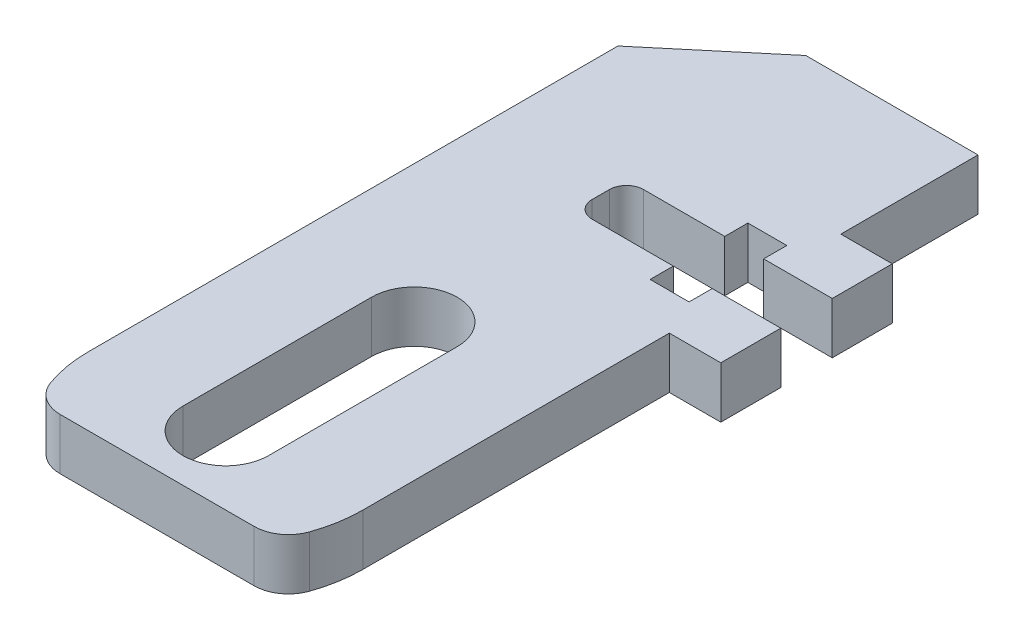
ISO-10303-21;
HEADER;
FILE_DESCRIPTION(('STEP AP214'),'2;1');
FILE_NAME('part.step','',(''),(''),'','','');
FILE_SCHEMA(('AUTOMOTIVE_DESIGN { 1 0 10303 214 1 1 1 1 }'));
ENDSEC;
DATA;
#1=APPLICATION_CONTEXT('core data for automotive mechanical design processes');
#2=APPLICATION_PROTOCOL_DEFINITION('international standard','automotive_design',2000,#1);
#3=PRODUCT_CONTEXT('',#1,'mechanical');
#4=PRODUCT('Part','Part','',(#3));
#5=PRODUCT_RELATED_PRODUCT_CATEGORY('part','',(#4));
#6=PRODUCT_DEFINITION_FORMATION('','',#4);
#7=PRODUCT_DEFINITION_CONTEXT('part definition',#1,'design');
#8=PRODUCT_DEFINITION('design','',#6,#7);
#9=PRODUCT_DEFINITION_SHAPE('','',#8);
#10=(LENGTH_UNIT() NAMED_UNIT(*) SI_UNIT(.MILLI.,.METRE.));
#11=(NAMED_UNIT(*) PLANE_ANGLE_UNIT() SI_UNIT($,.RADIAN.));
#12=(NAMED_UNIT(*) SI_UNIT($,.STERADIAN.) SOLID_ANGLE_UNIT());
#13=UNCERTAINTY_MEASURE_WITH_UNIT(LENGTH_MEASURE(1.E-05),#10,'distance_accuracy_value','');
#14=(GEOMETRIC_REPRESENTATION_CONTEXT(3) GLOBAL_UNCERTAINTY_ASSIGNED_CONTEXT((#13)) GLOBAL_UNIT_ASSIGNED_CONTEXT((#10,
#11,#12)) REPRESENTATION_CONTEXT('',''));
#15=CARTESIAN_POINT('',(0.,0.,0.));
#16=DIRECTION('',(0.,0.,1.));
#17=DIRECTION('',(1.,0.,0.));
#18=AXIS2_PLACEMENT_3D('',#15,#16,#17);
#19=CARTESIAN_POINT('',(11.,1.5,-27.870225));
#20=DIRECTION('',(-1.,0.,0.));
#21=DIRECTION('',(0.,0.,1.));
#22=AXIS2_PLACEMENT_3D('',#19,#20,#21);
#23=PLANE('',#22);
#24=DIRECTION('',(0.,0.,-1.));
#25=VECTOR('',#24,1.);
#26=CARTESIAN_POINT('',(11.,-1.5,-27.870225));
#27=LINE('',#26,#25);
#28=CARTESIAN_POINT('',(11.,-1.5,-17.870225));
#29=VERTEX_POINT('',#28);
#30=CARTESIAN_POINT('',(11.,-1.5,-21.370225));
#31=VERTEX_POINT('',#30);
#32=EDGE_CURVE('E300',#29,#31,#27,.T.);
#33=ORIENTED_EDGE('',*,*,#32,.T.);
#34=DIRECTION('',(0.,1.,0.));
#35=VECTOR('',#34,1.);
#36=CARTESIAN_POINT('',(11.,-1.5,-21.370225));
#37=LINE('',#36,#35);
#38=CARTESIAN_POINT('',(11.,1.5,-21.370225));
#39=VERTEX_POINT('',#38);
#40=EDGE_CURVE('E392',#31,#39,#37,.T.);
#41=ORIENTED_EDGE('',*,*,#40,.T.);
#42=DIRECTION('',(0.,0.,-1.));
#43=VECTOR('',#42,1.);
#44=CARTESIAN_POINT('',(11.,1.5,-27.870225));
#45=LINE('',#44,#43);
#46=CARTESIAN_POINT('',(11.,1.5,-17.870225));
#47=VERTEX_POINT('',#46);
#48=EDGE_CURVE('E265',#47,#39,#45,.T.);
#49=ORIENTED_EDGE('',*,*,#48,.F.);
#50=DIRECTION('',(0.,-1.,0.));
#51=VECTOR('',#50,1.);
#52=CARTESIAN_POINT('',(11.,1.5,-17.870225));
#53=LINE('',#52,#51);
#54=EDGE_CURVE('E327',#47,#29,#53,.T.);
#55=ORIENTED_EDGE('',*,*,#54,.T.);
#56=EDGE_LOOP('',(#33,#41,#49,#55));
#57=FACE_BOUND('',#56,.T.);
#58=ADVANCED_FACE('F39',(#57),#23,.F.);
#59=CARTESIAN_POINT('',(0.,1.5,0.));
#60=DIRECTION('',(0.,1.,0.));
#61=DIRECTION('',(0.,0.,1.));
#62=AXIS2_PLACEMENT_3D('',#59,#60,#61);
#63=PLANE('',#62);
#64=DIRECTION('',(1.,0.,0.));
#65=VECTOR('',#64,1.);
#66=CARTESIAN_POINT('',(11.,1.5,-21.370225));
#67=LINE('',#66,#65);
#68=CARTESIAN_POINT('',(6.99999999999999,1.5,-21.370225));
#69=VERTEX_POINT('',#68);
#70=EDGE_CURVE('E394',#69,#39,#67,.T.);
#71=ORIENTED_EDGE('',*,*,#70,.F.);
#72=DIRECTION('',(0.,0.,-1.));
#73=VECTOR('',#72,1.);
#74=CARTESIAN_POINT('',(6.99999999999999,1.5,-21.370225));
#75=LINE('',#74,#73);
#76=CARTESIAN_POINT('',(6.99999999999999,1.5,-20.020225));
#77=VERTEX_POINT('',#76);
#78=EDGE_CURVE('E397',#77,#69,#75,.T.);
#79=ORIENTED_EDGE('',*,*,#78,.F.);
#80=DIRECTION('',(1.,0.,0.));
#81=VECTOR('',#80,1.);
#82=CARTESIAN_POINT('',(4.72999999999999,1.5,-20.020225));
#83=LINE('',#82,#81);
#84=CARTESIAN_POINT('',(4.72999999999999,1.5,-20.020225));
#85=VERTEX_POINT('',#84);
#86=EDGE_CURVE('E402',#85,#77,#83,.T.);
#87=ORIENTED_EDGE('',*,*,#86,.F.);
#88=DIRECTION('',(0.,0.,1.));
#89=VECTOR('',#88,1.);
#90=CARTESIAN_POINT('',(4.72999999999999,1.5,-21.370225));
#91=LINE('',#90,#89);
#92=CARTESIAN_POINT('',(4.72999999999999,1.5,-21.370225));
#93=VERTEX_POINT('',#92);
#94=EDGE_CURVE('E849',#93,#85,#91,.T.);
#95=ORIENTED_EDGE('',*,*,#94,.F.);
#96=DIRECTION('',(1.,0.,0.));
#97=VECTOR('',#96,1.);
#98=CARTESIAN_POINT('',(4.72999999999999,1.5,-21.370225));
#99=LINE('',#98,#97);
#100=CARTESIAN_POINT('',(0.,1.5,-21.370225));
#101=VERTEX_POINT('',#100);
#102=EDGE_CURVE('E853',#101,#93,#99,.T.);
#103=ORIENTED_EDGE('',*,*,#102,.F.);
#104=CARTESIAN_POINT('',(0.,1.5,-22.370225));
#105=DIRECTION('',(0.,1.,0.));
#106=DIRECTION('',(0.,0.,-1.));
#107=AXIS2_PLACEMENT_3D('',#104,#105,#106);
#108=CIRCLE('',#107,0.999999999999999);
#109=CARTESIAN_POINT('',(-1.00000000000001,1.5,-22.370225));
#110=VERTEX_POINT('',#109);
#111=EDGE_CURVE('E842',#110,#101,#108,.T.);
#112=ORIENTED_EDGE('',*,*,#111,.F.);
#113=DIRECTION('',(0.,0.,1.));
#114=VECTOR('',#113,1.);
#115=CARTESIAN_POINT('',(-1.00000000000001,1.5,-23.370225));
#116=LINE('',#115,#114);
#117=CARTESIAN_POINT('',(-1.00000000000001,1.5,-23.370225));
#118=VERTEX_POINT('',#117);
#119=EDGE_CURVE('E838',#118,#110,#116,.T.);
#120=ORIENTED_EDGE('',*,*,#119,.F.);
#121=CARTESIAN_POINT('',(0.,1.5,-23.370225));
#122=DIRECTION('',(0.,1.,0.));
#123=DIRECTION('',(0.,0.,1.));
#124=AXIS2_PLACEMENT_3D('',#121,#122,#123);
#125=CIRCLE('',#124,0.999999999999999);
#126=CARTESIAN_POINT('',(0.,1.5,-24.370225));
#127=VERTEX_POINT('',#126);
#128=EDGE_CURVE('E859',#127,#118,#125,.T.);
#129=ORIENTED_EDGE('',*,*,#128,.F.);
#130=DIRECTION('',(-1.,0.,0.));
#131=VECTOR('',#130,1.);
#132=CARTESIAN_POINT('',(4.72999999999999,1.5,-24.370225));
#133=LINE('',#132,#131);
#134=CARTESIAN_POINT('',(4.72999999999999,1.5,-24.370225));
#135=VERTEX_POINT('',#134);
#136=EDGE_CURVE('E831',#135,#127,#133,.T.);
#137=ORIENTED_EDGE('',*,*,#136,.F.);
#138=DIRECTION('',(0.,0.,1.));
#139=VECTOR('',#138,1.);
#140=CARTESIAN_POINT('',(4.72999999999999,1.5,-25.720225));
#141=LINE('',#140,#139);
#142=CARTESIAN_POINT('',(4.72999999999999,1.5,-25.720225));
#143=VERTEX_POINT('',#142);
#144=EDGE_CURVE('E827',#143,#135,#141,.T.);
#145=ORIENTED_EDGE('',*,*,#144,.F.);
#146=DIRECTION('',(-1.,0.,0.));
#147=VECTOR('',#146,1.);
#148=CARTESIAN_POINT('',(4.72999999999999,1.5,-25.720225));
#149=LINE('',#148,#147);
#150=CARTESIAN_POINT('',(6.99999999999999,1.5,-25.720225));
#151=VERTEX_POINT('',#150);
#152=EDGE_CURVE('E863',#151,#143,#149,.T.);
#153=ORIENTED_EDGE('',*,*,#152,.F.);
#154=DIRECTION('',(0.,0.,-1.));
#155=VECTOR('',#154,1.);
#156=CARTESIAN_POINT('',(6.99999999999999,1.5,-25.720225));
#157=LINE('',#156,#155);
#158=CARTESIAN_POINT('',(6.99999999999999,1.5,-24.370225));
#159=VERTEX_POINT('',#158);
#160=EDGE_CURVE('E259',#159,#151,#157,.T.);
#161=ORIENTED_EDGE('',*,*,#160,.F.);
#162=DIRECTION('',(-1.,0.,0.));
#163=VECTOR('',#162,1.);
#164=CARTESIAN_POINT('',(11.,1.5,-24.370225));
#165=LINE('',#164,#163);
#166=CARTESIAN_POINT('',(11.,1.5,-24.370225));
#167=VERTEX_POINT('',#166);
#168=EDGE_CURVE('E243',#167,#159,#165,.T.);
#169=ORIENTED_EDGE('',*,*,#168,.F.);
#170=CARTESIAN_POINT('',(11.,1.5,-27.870225));
#171=VERTEX_POINT('',#170);
#172=EDGE_CURVE('E255',#167,#171,#45,.T.);
#173=ORIENTED_EDGE('',*,*,#172,.T.);
#174=DIRECTION('',(-1.,0.,0.));
#175=VECTOR('',#174,1.);
#176=CARTESIAN_POINT('',(7.99999999999999,1.5,-27.870225));
#177=LINE('',#176,#175);
#178=CARTESIAN_POINT('',(7.99999999999999,1.5,-27.870225));
#179=VERTEX_POINT('',#178);
#180=EDGE_CURVE('E269',#171,#179,#177,.T.);
#181=ORIENTED_EDGE('',*,*,#180,.T.);
#182=DIRECTION('',(0.,0.,-1.));
#183=VECTOR('',#182,1.);
#184=CARTESIAN_POINT('',(7.99999999999998,1.5,-30.870225));
#185=LINE('',#184,#183);
#186=CARTESIAN_POINT('',(7.99999999999999,1.5,-35.870225));
#187=VERTEX_POINT('',#186);
#188=EDGE_CURVE('E275',#179,#187,#185,.T.);
#189=ORIENTED_EDGE('',*,*,#188,.T.);
#190=DIRECTION('',(-1.,0.,0.));
#191=VECTOR('',#190,1.);
#192=CARTESIAN_POINT('',(-2.04123203702897,1.5,-35.870225));
#193=LINE('',#192,#191);
#194=CARTESIAN_POINT('',(-2.04123203702897,1.5,-35.870225));
#195=VERTEX_POINT('',#194);
#196=EDGE_CURVE('E277',#187,#195,#193,.T.);
#197=ORIENTED_EDGE('',*,*,#196,.T.);
#198=DIRECTION('',(-0.766044443118977,0.,0.64278760968654));
#199=VECTOR('',#198,1.);
#200=CARTESIAN_POINT('',(-8.,1.5,-30.870225));
#201=LINE('',#200,#199);
#202=CARTESIAN_POINT('',(-8.,1.5,-30.870225));
#203=VERTEX_POINT('',#202);
#204=EDGE_CURVE('E279',#195,#203,#201,.T.);
#205=ORIENTED_EDGE('',*,*,#204,.T.);
#206=DIRECTION('',(0.,0.,1.));
#207=VECTOR('',#206,1.);
#208=CARTESIAN_POINT('',(-8.00000000000001,1.5,-10.748624987133));
#209=LINE('',#208,#207);
#210=CARTESIAN_POINT('',(-8.,1.5,0.));
#211=VERTEX_POINT('',#210);
#212=EDGE_CURVE('E314',#203,#211,#209,.T.);
#213=ORIENTED_EDGE('',*,*,#212,.T.);
#214=CARTESIAN_POINT('',(0.,1.5,0.));
#215=DIRECTION('',(0.,1.,0.));
#216=DIRECTION('',(0.,0.,1.));
#217=AXIS2_PLACEMENT_3D('',#214,#215,#216);
#218=CIRCLE('',#217,8.);
#219=CARTESIAN_POINT('',(-7.54247233265651,1.5,2.66666666666667));
#220=VERTEX_POINT('',#219);
#221=EDGE_CURVE('E493',#211,#220,#218,.T.);
#222=ORIENTED_EDGE('',*,*,#221,.T.);
#223=CARTESIAN_POINT('',(-5.65685424949238,1.5,2.));
#224=DIRECTION('',(0.,1.,0.));
#225=DIRECTION('',(0.,0.,-1.));
#226=AXIS2_PLACEMENT_3D('',#223,#224,#225);
#227=CIRCLE('',#226,2.);
#228=CARTESIAN_POINT('',(-5.65685424949238,1.5,4.));
#229=VERTEX_POINT('',#228);
#230=EDGE_CURVE('E351',#220,#229,#227,.T.);
#231=ORIENTED_EDGE('',*,*,#230,.T.);
#232=DIRECTION('',(1.,0.,0.));
#233=VECTOR('',#232,1.);
#234=CARTESIAN_POINT('',(-5.65685424949238,1.5,4.));
#235=LINE('',#234,#233);
#236=CARTESIAN_POINT('',(5.65685424949238,1.5,4.));
#237=VERTEX_POINT('',#236);
#238=EDGE_CURVE('E373',#229,#237,#235,.T.);
#239=ORIENTED_EDGE('',*,*,#238,.T.);
#240=CARTESIAN_POINT('',(5.65685424949238,1.5,2.));
#241=DIRECTION('',(0.,1.,0.));
#242=DIRECTION('',(0.,0.,1.));
#243=AXIS2_PLACEMENT_3D('',#240,#241,#242);
#244=CIRCLE('',#243,2.);
#245=CARTESIAN_POINT('',(7.5424723326565,1.5,2.66666666666666));
#246=VERTEX_POINT('',#245);
#247=EDGE_CURVE('E370',#237,#246,#244,.T.);
#248=ORIENTED_EDGE('',*,*,#247,.T.);
#249=CARTESIAN_POINT('',(0.,1.5,0.));
#250=DIRECTION('',(0.,1.,0.));
#251=DIRECTION('',(0.,0.,1.));
#252=AXIS2_PLACEMENT_3D('',#249,#250,#251);
#253=CIRCLE('',#252,8.);
#254=CARTESIAN_POINT('',(7.99999999999999,1.5,0.));
#255=VERTEX_POINT('',#254);
#256=EDGE_CURVE('E372',#246,#255,#253,.T.);
#257=ORIENTED_EDGE('',*,*,#256,.T.);
#258=DIRECTION('',(0.,0.,-1.));
#259=VECTOR('',#258,1.);
#260=CARTESIAN_POINT('',(7.99999999999999,1.5,-10.748624987133));
#261=LINE('',#260,#259);
#262=CARTESIAN_POINT('',(7.99999999999999,1.5,-17.870225));
#263=VERTEX_POINT('',#262);
#264=EDGE_CURVE('E270',#255,#263,#261,.T.);
#265=ORIENTED_EDGE('',*,*,#264,.T.);
#266=DIRECTION('',(1.,0.,0.));
#267=VECTOR('',#266,1.);
#268=CARTESIAN_POINT('',(7.99999999999999,1.5,-17.870225));
#269=LINE('',#268,#267);
#270=EDGE_CURVE('E266',#263,#47,#269,.T.);
#271=ORIENTED_EDGE('',*,*,#270,.T.);
#272=ORIENTED_EDGE('',*,*,#48,.T.);
#273=EDGE_LOOP('',(#71,#79,#87,#95,#103,#112,#120,#129,#137,#145,#153,#161,#169,#173,#181,#189,
#197,#205,#213,#222,#231,#239,#248,#257,#265,#271,#272));
#274=FACE_BOUND('',#273,.T.);
#275=DIRECTION('',(0.,0.,-1.));
#276=VECTOR('',#275,1.);
#277=CARTESIAN_POINT('',(2.5,1.5,0.));
#278=LINE('',#277,#276);
#279=CARTESIAN_POINT('',(2.5,1.5,0.));
#280=VERTEX_POINT('',#279);
#281=CARTESIAN_POINT('',(2.5,1.5,-11.));
#282=VERTEX_POINT('',#281);
#283=EDGE_CURVE('E466',#280,#282,#278,.T.);
#284=ORIENTED_EDGE('',*,*,#283,.F.);
#285=CARTESIAN_POINT('',(0.,1.5,0.));
#286=DIRECTION('',(0.,1.,0.));
#287=DIRECTION('',(0.,0.,1.));
#288=AXIS2_PLACEMENT_3D('',#285,#286,#287);
#289=CIRCLE('',#288,2.5);
#290=CARTESIAN_POINT('',(-2.5,1.5,0.));
#291=VERTEX_POINT('',#290);
#292=EDGE_CURVE('E464',#291,#280,#289,.T.);
#293=ORIENTED_EDGE('',*,*,#292,.F.);
#294=DIRECTION('',(0.,0.,1.));
#295=VECTOR('',#294,1.);
#296=CARTESIAN_POINT('',(-2.5,1.5,0.));
#297=LINE('',#296,#295);
#298=CARTESIAN_POINT('',(-2.5,1.5,-11.));
#299=VERTEX_POINT('',#298);
#300=EDGE_CURVE('E471',#299,#291,#297,.T.);
#301=ORIENTED_EDGE('',*,*,#300,.F.);
#302=CARTESIAN_POINT('',(0.,1.5,-11.));
#303=DIRECTION('',(0.,1.,0.));
#304=DIRECTION('',(0.,0.,1.));
#305=AXIS2_PLACEMENT_3D('',#302,#303,#304);
#306=CIRCLE('',#305,2.5);
#307=EDGE_CURVE('E469',#282,#299,#306,.T.);
#308=ORIENTED_EDGE('',*,*,#307,.F.);
#309=EDGE_LOOP('',(#284,#293,#301,#308));
#310=FACE_BOUND('',#309,.T.);
#311=ADVANCED_FACE('F253',(#274,#310),#63,.T.);
#312=CARTESIAN_POINT('',(0.,-1.5,0.));
#313=DIRECTION('',(0.,1.,0.));
#314=DIRECTION('',(0.,0.,1.));
#315=AXIS2_PLACEMENT_3D('',#312,#313,#314);
#316=PLANE('',#315);
#317=DIRECTION('',(0.,0.,-1.));
#318=VECTOR('',#317,1.);
#319=CARTESIAN_POINT('',(6.99999999999999,-1.5,-21.370225));
#320=LINE('',#319,#318);
#321=CARTESIAN_POINT('',(6.99999999999999,-1.5,-20.020225));
#322=VERTEX_POINT('',#321);
#323=CARTESIAN_POINT('',(6.99999999999999,-1.5,-21.370225));
#324=VERTEX_POINT('',#323);
#325=EDGE_CURVE('E435',#322,#324,#320,.T.);
#326=ORIENTED_EDGE('',*,*,#325,.T.);
#327=DIRECTION('',(1.,0.,0.));
#328=VECTOR('',#327,1.);
#329=CARTESIAN_POINT('',(11.,-1.5,-21.370225));
#330=LINE('',#329,#328);
#331=EDGE_CURVE('E249',#324,#31,#330,.T.);
#332=ORIENTED_EDGE('',*,*,#331,.T.);
#333=ORIENTED_EDGE('',*,*,#32,.F.);
#334=DIRECTION('',(1.,0.,0.));
#335=VECTOR('',#334,1.);
#336=CARTESIAN_POINT('',(7.99999999999999,-1.5,-17.870225));
#337=LINE('',#336,#335);
#338=CARTESIAN_POINT('',(7.99999999999999,-1.5,-17.870225));
#339=VERTEX_POINT('',#338);
#340=EDGE_CURVE('E297',#339,#29,#337,.T.);
#341=ORIENTED_EDGE('',*,*,#340,.F.);
#342=DIRECTION('',(0.,0.,-1.));
#343=VECTOR('',#342,1.);
#344=CARTESIAN_POINT('',(7.99999999999999,-1.5,-17.870225));
#345=LINE('',#344,#343);
#346=CARTESIAN_POINT('',(7.99999999999999,-1.5,0.));
#347=VERTEX_POINT('',#346);
#348=EDGE_CURVE('E295',#347,#339,#345,.T.);
#349=ORIENTED_EDGE('',*,*,#348,.F.);
#350=CARTESIAN_POINT('',(0.,-1.5,0.));
#351=DIRECTION('',(0.,1.,0.));
#352=DIRECTION('',(0.,0.,1.));
#353=AXIS2_PLACEMENT_3D('',#350,#351,#352);
#354=CIRCLE('',#353,8.);
#355=CARTESIAN_POINT('',(7.5424723326565,-1.5,2.66666666666666));
#356=VERTEX_POINT('',#355);
#357=EDGE_CURVE('E292',#356,#347,#354,.T.);
#358=ORIENTED_EDGE('',*,*,#357,.F.);
#359=CARTESIAN_POINT('',(5.65685424949238,-1.5,2.));
#360=DIRECTION('',(0.,1.,0.));
#361=DIRECTION('',(0.,0.,1.));
#362=AXIS2_PLACEMENT_3D('',#359,#360,#361);
#363=CIRCLE('',#362,2.);
#364=CARTESIAN_POINT('',(5.65685424949238,-1.5,4.));
#365=VERTEX_POINT('',#364);
#366=EDGE_CURVE('E290',#365,#356,#363,.T.);
#367=ORIENTED_EDGE('',*,*,#366,.F.);
#368=DIRECTION('',(1.,0.,0.));
#369=VECTOR('',#368,1.);
#370=CARTESIAN_POINT('',(-5.65685424949238,-1.5,4.));
#371=LINE('',#370,#369);
#372=CARTESIAN_POINT('',(-5.65685424949238,-1.5,4.));
#373=VERTEX_POINT('',#372);
#374=EDGE_CURVE('E288',#373,#365,#371,.T.);
#375=ORIENTED_EDGE('',*,*,#374,.F.);
#376=CARTESIAN_POINT('',(-5.65685424949238,-1.5,2.));
#377=DIRECTION('',(0.,1.,0.));
#378=DIRECTION('',(0.,0.,-1.));
#379=AXIS2_PLACEMENT_3D('',#376,#377,#378);
#380=CIRCLE('',#379,2.);
#381=CARTESIAN_POINT('',(-7.54247233265651,-1.5,2.66666666666667));
#382=VERTEX_POINT('',#381);
#383=EDGE_CURVE('E285',#382,#373,#380,.T.);
#384=ORIENTED_EDGE('',*,*,#383,.F.);
#385=CARTESIAN_POINT('',(0.,-1.5,0.));
#386=DIRECTION('',(0.,1.,0.));
#387=DIRECTION('',(0.,0.,1.));
#388=AXIS2_PLACEMENT_3D('',#385,#386,#387);
#389=CIRCLE('',#388,8.);
#390=CARTESIAN_POINT('',(-8.,-1.5,0.));
#391=VERTEX_POINT('',#390);
#392=EDGE_CURVE('E283',#391,#382,#389,.T.);
#393=ORIENTED_EDGE('',*,*,#392,.F.);
#394=DIRECTION('',(0.,0.,1.));
#395=VECTOR('',#394,1.);
#396=CARTESIAN_POINT('',(-8.00000000000001,-1.5,-10.748624987133));
#397=LINE('',#396,#395);
#398=CARTESIAN_POINT('',(-8.,-1.5,-30.870225));
#399=VERTEX_POINT('',#398);
#400=EDGE_CURVE('E312',#399,#391,#397,.T.);
#401=ORIENTED_EDGE('',*,*,#400,.F.);
#402=DIRECTION('',(-0.766044443118977,0.,0.64278760968654));
#403=VECTOR('',#402,1.);
#404=CARTESIAN_POINT('',(-8.,-1.5,-30.870225));
#405=LINE('',#404,#403);
#406=CARTESIAN_POINT('',(-2.04123203702897,-1.5,-35.870225));
#407=VERTEX_POINT('',#406);
#408=EDGE_CURVE('E310',#407,#399,#405,.T.);
#409=ORIENTED_EDGE('',*,*,#408,.F.);
#410=DIRECTION('',(-1.,0.,0.));
#411=VECTOR('',#410,1.);
#412=CARTESIAN_POINT('',(-2.04123203702897,-1.5,-35.870225));
#413=LINE('',#412,#411);
#414=CARTESIAN_POINT('',(7.99999999999999,-1.5,-35.870225));
#415=VERTEX_POINT('',#414);
#416=EDGE_CURVE('E308',#415,#407,#413,.T.);
#417=ORIENTED_EDGE('',*,*,#416,.F.);
#418=DIRECTION('',(0.,0.,-1.));
#419=VECTOR('',#418,1.);
#420=CARTESIAN_POINT('',(7.99999999999999,-1.5,-35.870225));
#421=LINE('',#420,#419);
#422=CARTESIAN_POINT('',(7.99999999999999,-1.5,-27.870225));
#423=VERTEX_POINT('',#422);
#424=EDGE_CURVE('E306',#423,#415,#421,.T.);
#425=ORIENTED_EDGE('',*,*,#424,.F.);
#426=DIRECTION('',(-1.,0.,0.));
#427=VECTOR('',#426,1.);
#428=CARTESIAN_POINT('',(7.99999999999999,-1.5,-27.870225));
#429=LINE('',#428,#427);
#430=CARTESIAN_POINT('',(11.,-1.5,-27.870225));
#431=VERTEX_POINT('',#430);
#432=EDGE_CURVE('E303',#431,#423,#429,.T.);
#433=ORIENTED_EDGE('',*,*,#432,.F.);
#434=CARTESIAN_POINT('',(11.,-1.5,-24.370225));
#435=VERTEX_POINT('',#434);
#436=EDGE_CURVE('E299',#435,#431,#27,.T.);
#437=ORIENTED_EDGE('',*,*,#436,.F.);
#438=DIRECTION('',(-1.,0.,0.));
#439=VECTOR('',#438,1.);
#440=CARTESIAN_POINT('',(11.,-1.5,-24.370225));
#441=LINE('',#440,#439);
#442=CARTESIAN_POINT('',(6.99999999999999,-1.5,-24.370225));
#443=VERTEX_POINT('',#442);
#444=EDGE_CURVE('E54',#435,#443,#441,.T.);
#445=ORIENTED_EDGE('',*,*,#444,.T.);
#446=DIRECTION('',(0.,0.,-1.));
#447=VECTOR('',#446,1.);
#448=CARTESIAN_POINT('',(6.99999999999999,-1.5,-25.720225));
#449=LINE('',#448,#447);
#450=CARTESIAN_POINT('',(6.99999999999999,-1.5,-25.720225));
#451=VERTEX_POINT('',#450);
#452=EDGE_CURVE('E400',#443,#451,#449,.T.);
#453=ORIENTED_EDGE('',*,*,#452,.T.);
#454=DIRECTION('',(-1.,0.,0.));
#455=VECTOR('',#454,1.);
#456=CARTESIAN_POINT('',(4.72999999999999,-1.5,-25.720225));
#457=LINE('',#456,#455);
#458=CARTESIAN_POINT('',(4.72999999999999,-1.5,-25.720225));
#459=VERTEX_POINT('',#458);
#460=EDGE_CURVE('E408',#451,#459,#457,.T.);
#461=ORIENTED_EDGE('',*,*,#460,.T.);
#462=DIRECTION('',(0.,0.,1.));
#463=VECTOR('',#462,1.);
#464=CARTESIAN_POINT('',(4.72999999999999,-1.5,-25.720225));
#465=LINE('',#464,#463);
#466=CARTESIAN_POINT('',(4.72999999999999,-1.5,-24.370225));
#467=VERTEX_POINT('',#466);
#468=EDGE_CURVE('E411',#459,#467,#465,.T.);
#469=ORIENTED_EDGE('',*,*,#468,.T.);
#470=DIRECTION('',(-1.,0.,0.));
#471=VECTOR('',#470,1.);
#472=CARTESIAN_POINT('',(4.72999999999999,-1.5,-24.370225));
#473=LINE('',#472,#471);
#474=CARTESIAN_POINT('',(0.,-1.5,-24.370225));
#475=VERTEX_POINT('',#474);
#476=EDGE_CURVE('E414',#467,#475,#473,.T.);
#477=ORIENTED_EDGE('',*,*,#476,.T.);
#478=CARTESIAN_POINT('',(0.,-1.5,-23.370225));
#479=DIRECTION('',(0.,1.,0.));
#480=DIRECTION('',(0.,0.,1.));
#481=AXIS2_PLACEMENT_3D('',#478,#479,#480);
#482=CIRCLE('',#481,0.999999999999999);
#483=CARTESIAN_POINT('',(-1.00000000000001,-1.5,-23.370225));
#484=VERTEX_POINT('',#483);
#485=EDGE_CURVE('E417',#475,#484,#482,.T.);
#486=ORIENTED_EDGE('',*,*,#485,.T.);
#487=DIRECTION('',(0.,0.,1.));
#488=VECTOR('',#487,1.);
#489=CARTESIAN_POINT('',(-1.00000000000001,-1.5,-23.370225));
#490=LINE('',#489,#488);
#491=CARTESIAN_POINT('',(-1.00000000000001,-1.5,-22.370225));
#492=VERTEX_POINT('',#491);
#493=EDGE_CURVE('E420',#484,#492,#490,.T.);
#494=ORIENTED_EDGE('',*,*,#493,.T.);
#495=CARTESIAN_POINT('',(0.,-1.5,-22.370225));
#496=DIRECTION('',(0.,1.,0.));
#497=DIRECTION('',(0.,0.,-1.));
#498=AXIS2_PLACEMENT_3D('',#495,#496,#497);
#499=CIRCLE('',#498,0.999999999999999);
#500=CARTESIAN_POINT('',(0.,-1.5,-21.370225));
#501=VERTEX_POINT('',#500);
#502=EDGE_CURVE('E423',#492,#501,#499,.T.);
#503=ORIENTED_EDGE('',*,*,#502,.T.);
#504=DIRECTION('',(1.,0.,0.));
#505=VECTOR('',#504,1.);
#506=CARTESIAN_POINT('',(4.72999999999999,-1.5,-21.370225));
#507=LINE('',#506,#505);
#508=CARTESIAN_POINT('',(4.72999999999999,-1.5,-21.370225));
#509=VERTEX_POINT('',#508);
#510=EDGE_CURVE('E426',#501,#509,#507,.T.);
#511=ORIENTED_EDGE('',*,*,#510,.T.);
#512=DIRECTION('',(0.,0.,1.));
#513=VECTOR('',#512,1.);
#514=CARTESIAN_POINT('',(4.72999999999999,-1.5,-21.370225));
#515=LINE('',#514,#513);
#516=CARTESIAN_POINT('',(4.72999999999999,-1.5,-20.020225));
#517=VERTEX_POINT('',#516);
#518=EDGE_CURVE('E429',#509,#517,#515,.T.);
#519=ORIENTED_EDGE('',*,*,#518,.T.);
#520=DIRECTION('',(1.,0.,0.));
#521=VECTOR('',#520,1.);
#522=CARTESIAN_POINT('',(4.72999999999999,-1.5,-20.020225));
#523=LINE('',#522,#521);
#524=EDGE_CURVE('E432',#517,#322,#523,.T.);
#525=ORIENTED_EDGE('',*,*,#524,.T.);
#526=EDGE_LOOP('',(#326,#332,#333,#341,#349,#358,#367,#375,#384,#393,#401,#409,#417,#425,#433,
#437,#445,#453,#461,#469,#477,#486,#494,#503,#511,#519,#525));
#527=FACE_BOUND('',#526,.T.);
#528=CARTESIAN_POINT('',(0.,-1.5,0.));
#529=DIRECTION('',(0.,1.,0.));
#530=DIRECTION('',(0.,0.,1.));
#531=AXIS2_PLACEMENT_3D('',#528,#529,#530);
#532=CIRCLE('',#531,2.5);
#533=CARTESIAN_POINT('',(-2.5,-1.5,0.));
#534=VERTEX_POINT('',#533);
#535=CARTESIAN_POINT('',(2.5,-1.5,0.));
#536=VERTEX_POINT('',#535);
#537=EDGE_CURVE('E440',#534,#536,#532,.T.);
#538=ORIENTED_EDGE('',*,*,#537,.T.);
#539=DIRECTION('',(0.,0.,-1.));
#540=VECTOR('',#539,1.);
#541=CARTESIAN_POINT('',(2.5,-1.5,0.));
#542=LINE('',#541,#540);
#543=CARTESIAN_POINT('',(2.5,-1.5,-11.));
#544=VERTEX_POINT('',#543);
#545=EDGE_CURVE('E476',#536,#544,#542,.T.);
#546=ORIENTED_EDGE('',*,*,#545,.T.);
#547=CARTESIAN_POINT('',(0.,-1.5,-11.));
#548=DIRECTION('',(0.,1.,0.));
#549=DIRECTION('',(0.,0.,1.));
#550=AXIS2_PLACEMENT_3D('',#547,#548,#549);
#551=CIRCLE('',#550,2.5);
#552=CARTESIAN_POINT('',(-2.5,-1.5,-11.));
#553=VERTEX_POINT('',#552);
#554=EDGE_CURVE('E479',#544,#553,#551,.T.);
#555=ORIENTED_EDGE('',*,*,#554,.T.);
#556=DIRECTION('',(0.,0.,1.));
#557=VECTOR('',#556,1.);
#558=CARTESIAN_POINT('',(-2.5,-1.5,0.));
#559=LINE('',#558,#557);
#560=EDGE_CURVE('E467',#553,#534,#559,.T.);
#561=ORIENTED_EDGE('',*,*,#560,.T.);
#562=EDGE_LOOP('',(#538,#546,#555,#561));
#563=FACE_BOUND('',#562,.T.);
#564=ADVANCED_FACE('F357',(#527,#563),#316,.F.);
#565=CARTESIAN_POINT('',(0.,1.5,0.));
#566=DIRECTION('',(0.,-1.,0.));
#567=DIRECTION('',(0.,0.,-1.));
#568=AXIS2_PLACEMENT_3D('',#565,#566,#567);
#569=CYLINDRICAL_SURFACE('',#568,8.);
#570=ORIENTED_EDGE('',*,*,#392,.T.);
#571=DIRECTION('',(0.,-1.,0.));
#572=VECTOR('',#571,1.);
#573=CARTESIAN_POINT('',(-7.54247233265651,1.5,2.66666666666667));
#574=LINE('',#573,#572);
#575=EDGE_CURVE('E47',#220,#382,#574,.T.);
#576=ORIENTED_EDGE('',*,*,#575,.F.);
#577=ORIENTED_EDGE('',*,*,#221,.F.);
#578=DIRECTION('',(0.,-1.,0.));
#579=VECTOR('',#578,1.);
#580=CARTESIAN_POINT('',(-8.,1.5,0.));
#581=LINE('',#580,#579);
#582=EDGE_CURVE('E11',#211,#391,#581,.T.);
#583=ORIENTED_EDGE('',*,*,#582,.T.);
#584=EDGE_LOOP('',(#570,#576,#577,#583));
#585=FACE_BOUND('',#584,.T.);
#586=ADVANCED_FACE('F41',(#585),#569,.T.);
#587=CARTESIAN_POINT('',(-5.65685424949238,1.5,2.));
#588=DIRECTION('',(0.,-1.,0.));
#589=DIRECTION('',(0.,0.,-1.));
#590=AXIS2_PLACEMENT_3D('',#587,#588,#589);
#591=CYLINDRICAL_SURFACE('',#590,2.);
#592=ORIENTED_EDGE('',*,*,#383,.T.);
#593=DIRECTION('',(0.,-1.,0.));
#594=VECTOR('',#593,1.);
#595=CARTESIAN_POINT('',(-5.65685424949238,1.5,4.));
#596=LINE('',#595,#594);
#597=EDGE_CURVE('E342',#229,#373,#596,.T.);
#598=ORIENTED_EDGE('',*,*,#597,.F.);
#599=ORIENTED_EDGE('',*,*,#230,.F.);
#600=ORIENTED_EDGE('',*,*,#575,.T.);
#601=EDGE_LOOP('',(#592,#598,#599,#600));
#602=FACE_BOUND('',#601,.T.);
#603=ADVANCED_FACE('F349',(#602),#591,.T.);
#604=CARTESIAN_POINT('',(-5.65685424949238,1.5,4.));
#605=DIRECTION('',(0.,0.,-1.));
#606=DIRECTION('',(-1.,0.,0.));
#607=AXIS2_PLACEMENT_3D('',#604,#605,#606);
#608=PLANE('',#607);
#609=ORIENTED_EDGE('',*,*,#374,.T.);
#610=DIRECTION('',(0.,-1.,0.));
#611=VECTOR('',#610,1.);
#612=CARTESIAN_POINT('',(5.65685424949238,1.5,4.));
#613=LINE('',#612,#611);
#614=EDGE_CURVE('E339',#237,#365,#613,.T.);
#615=ORIENTED_EDGE('',*,*,#614,.F.);
#616=ORIENTED_EDGE('',*,*,#238,.F.);
#617=ORIENTED_EDGE('',*,*,#597,.T.);
#618=EDGE_LOOP('',(#609,#615,#616,#617));
#619=FACE_BOUND('',#618,.T.);
#620=ADVANCED_FACE('F364',(#619),#608,.F.);
#621=CARTESIAN_POINT('',(5.65685424949238,1.5,2.));
#622=DIRECTION('',(0.,-1.,0.));
#623=DIRECTION('',(0.,0.,-1.));
#624=AXIS2_PLACEMENT_3D('',#621,#622,#623);
#625=CYLINDRICAL_SURFACE('',#624,2.);
#626=ORIENTED_EDGE('',*,*,#366,.T.);
#627=DIRECTION('',(0.,-1.,0.));
#628=VECTOR('',#627,1.);
#629=CARTESIAN_POINT('',(7.5424723326565,1.5,2.66666666666666));
#630=LINE('',#629,#628);
#631=EDGE_CURVE('E336',#246,#356,#630,.T.);
#632=ORIENTED_EDGE('',*,*,#631,.F.);
#633=ORIENTED_EDGE('',*,*,#247,.F.);
#634=ORIENTED_EDGE('',*,*,#614,.T.);
#635=EDGE_LOOP('',(#626,#632,#633,#634));
#636=FACE_BOUND('',#635,.T.);
#637=ADVANCED_FACE('F368',(#636),#625,.T.);
#638=CARTESIAN_POINT('',(0.,1.5,0.));
#639=DIRECTION('',(0.,-1.,0.));
#640=DIRECTION('',(0.,0.,-1.));
#641=AXIS2_PLACEMENT_3D('',#638,#639,#640);
#642=CYLINDRICAL_SURFACE('',#641,8.);
#643=ORIENTED_EDGE('',*,*,#357,.T.);
#644=DIRECTION('',(0.,-1.,0.));
#645=VECTOR('',#644,1.);
#646=CARTESIAN_POINT('',(7.99999999999999,1.5,0.));
#647=LINE('',#646,#645);
#648=EDGE_CURVE('E333',#255,#347,#647,.T.);
#649=ORIENTED_EDGE('',*,*,#648,.F.);
#650=ORIENTED_EDGE('',*,*,#256,.F.);
#651=ORIENTED_EDGE('',*,*,#631,.T.);
#652=EDGE_LOOP('',(#643,#649,#650,#651));
#653=FACE_BOUND('',#652,.T.);
#654=ADVANCED_FACE('F533',(#653),#642,.T.);
#655=CARTESIAN_POINT('',(7.99999999999999,1.5,-17.870225));
#656=DIRECTION('',(-1.,0.,0.));
#657=DIRECTION('',(0.,0.,1.));
#658=AXIS2_PLACEMENT_3D('',#655,#656,#657);
#659=PLANE('',#658);
#660=ORIENTED_EDGE('',*,*,#348,.T.);
#661=DIRECTION('',(0.,-1.,0.));
#662=VECTOR('',#661,1.);
#663=CARTESIAN_POINT('',(7.99999999999999,1.5,-17.870225));
#664=LINE('',#663,#662);
#665=EDGE_CURVE('E330',#263,#339,#664,.T.);
#666=ORIENTED_EDGE('',*,*,#665,.F.);
#667=ORIENTED_EDGE('',*,*,#264,.F.);
#668=ORIENTED_EDGE('',*,*,#648,.T.);
#669=EDGE_LOOP('',(#660,#666,#667,#668));
#670=FACE_BOUND('',#669,.T.);
#671=ADVANCED_FACE('F384',(#670),#659,.F.);
#672=CARTESIAN_POINT('',(7.99999999999999,1.5,-17.870225));
#673=DIRECTION('',(0.,0.,-1.));
#674=DIRECTION('',(-1.,0.,0.));
#675=AXIS2_PLACEMENT_3D('',#672,#673,#674);
#676=PLANE('',#675);
#677=ORIENTED_EDGE('',*,*,#340,.T.);
#678=ORIENTED_EDGE('',*,*,#54,.F.);
#679=ORIENTED_EDGE('',*,*,#270,.F.);
#680=ORIENTED_EDGE('',*,*,#665,.T.);
#681=EDGE_LOOP('',(#677,#678,#679,#680));
#682=FACE_BOUND('',#681,.T.);
#683=ADVANCED_FACE('F387',(#682),#676,.F.);
#684=ORIENTED_EDGE('',*,*,#172,.F.);
#685=DIRECTION('',(0.,1.,0.));
#686=VECTOR('',#685,1.);
#687=CARTESIAN_POINT('',(11.,-1.5,-24.370225));
#688=LINE('',#687,#686);
#689=EDGE_CURVE('E240',#435,#167,#688,.T.);
#690=ORIENTED_EDGE('',*,*,#689,.F.);
#691=ORIENTED_EDGE('',*,*,#436,.T.);
#692=DIRECTION('',(0.,-1.,0.));
#693=VECTOR('',#692,1.);
#694=CARTESIAN_POINT('',(11.,1.5,-27.870225));
#695=LINE('',#694,#693);
#696=EDGE_CURVE('E263',#171,#431,#695,.T.);
#697=ORIENTED_EDGE('',*,*,#696,.F.);
#698=EDGE_LOOP('',(#684,#690,#691,#697));
#699=FACE_BOUND('',#698,.T.);
#700=ADVANCED_FACE('F261',(#699),#23,.F.);
#701=CARTESIAN_POINT('',(7.99999999999999,1.5,-27.870225));
#702=DIRECTION('',(0.,0.,1.));
#703=DIRECTION('',(1.,0.,0.));
#704=AXIS2_PLACEMENT_3D('',#701,#702,#703);
#705=PLANE('',#704);
#706=ORIENTED_EDGE('',*,*,#432,.T.);
#707=DIRECTION('',(0.,-1.,0.));
#708=VECTOR('',#707,1.);
#709=CARTESIAN_POINT('',(7.99999999999999,1.5,-27.870225));
#710=LINE('',#709,#708);
#711=EDGE_CURVE('E323',#179,#423,#710,.T.);
#712=ORIENTED_EDGE('',*,*,#711,.F.);
#713=ORIENTED_EDGE('',*,*,#180,.F.);
#714=ORIENTED_EDGE('',*,*,#696,.T.);
#715=EDGE_LOOP('',(#706,#712,#713,#714));
#716=FACE_BOUND('',#715,.T.);
#717=ADVANCED_FACE('F514',(#716),#705,.F.);
#718=CARTESIAN_POINT('',(7.99999999999999,1.5,-35.870225));
#719=DIRECTION('',(-1.,0.,0.));
#720=DIRECTION('',(0.,0.,1.));
#721=AXIS2_PLACEMENT_3D('',#718,#719,#720);
#722=PLANE('',#721);
#723=ORIENTED_EDGE('',*,*,#424,.T.);
#724=DIRECTION('',(0.,-1.,0.));
#725=VECTOR('',#724,1.);
#726=CARTESIAN_POINT('',(7.99999999999999,1.5,-35.870225));
#727=LINE('',#726,#725);
#728=EDGE_CURVE('E320',#187,#415,#727,.T.);
#729=ORIENTED_EDGE('',*,*,#728,.F.);
#730=ORIENTED_EDGE('',*,*,#188,.F.);
#731=ORIENTED_EDGE('',*,*,#711,.T.);
#732=EDGE_LOOP('',(#723,#729,#730,#731));
#733=FACE_BOUND('',#732,.T.);
#734=ADVANCED_FACE('F510',(#733),#722,.F.);
#735=CARTESIAN_POINT('',(-2.04123203702897,1.5,-35.870225));
#736=DIRECTION('',(0.,0.,1.));
#737=DIRECTION('',(1.,0.,0.));
#738=AXIS2_PLACEMENT_3D('',#735,#736,#737);
#739=PLANE('',#738);
#740=ORIENTED_EDGE('',*,*,#416,.T.);
#741=DIRECTION('',(0.,-1.,0.));
#742=VECTOR('',#741,1.);
#743=CARTESIAN_POINT('',(-2.04123203702897,1.5,-35.870225));
#744=LINE('',#743,#742);
#745=EDGE_CURVE('E317',#195,#407,#744,.T.);
#746=ORIENTED_EDGE('',*,*,#745,.F.);
#747=ORIENTED_EDGE('',*,*,#196,.F.);
#748=ORIENTED_EDGE('',*,*,#728,.T.);
#749=EDGE_LOOP('',(#740,#746,#747,#748));
#750=FACE_BOUND('',#749,.T.);
#751=ADVANCED_FACE('F506',(#750),#739,.F.);
#752=CARTESIAN_POINT('',(-8.,1.5,-30.870225));
#753=DIRECTION('',(0.64278760968654,0.,0.766044443118977));
#754=DIRECTION('',(0.766044443118977,0.,-0.64278760968654));
#755=AXIS2_PLACEMENT_3D('',#752,#753,#754);
#756=PLANE('',#755);
#757=ORIENTED_EDGE('',*,*,#408,.T.);
#758=DIRECTION('',(0.,-1.,0.));
#759=VECTOR('',#758,1.);
#760=CARTESIAN_POINT('',(-8.,1.5,-30.870225));
#761=LINE('',#760,#759);
#762=EDGE_CURVE('E282',#203,#399,#761,.T.);
#763=ORIENTED_EDGE('',*,*,#762,.F.);
#764=ORIENTED_EDGE('',*,*,#204,.F.);
#765=ORIENTED_EDGE('',*,*,#745,.T.);
#766=EDGE_LOOP('',(#757,#763,#764,#765));
#767=FACE_BOUND('',#766,.T.);
#768=ADVANCED_FACE('F501',(#767),#756,.F.);
#769=CARTESIAN_POINT('',(-8.00000000000001,1.5,-10.748624987133));
#770=DIRECTION('',(1.,0.,0.));
#771=DIRECTION('',(0.,0.,-1.));
#772=AXIS2_PLACEMENT_3D('',#769,#770,#771);
#773=PLANE('',#772);
#774=ORIENTED_EDGE('',*,*,#400,.T.);
#775=ORIENTED_EDGE('',*,*,#582,.F.);
#776=ORIENTED_EDGE('',*,*,#212,.F.);
#777=ORIENTED_EDGE('',*,*,#762,.T.);
#778=EDGE_LOOP('',(#774,#775,#776,#777));
#779=FACE_BOUND('',#778,.T.);
#780=ADVANCED_FACE('F496',(#779),#773,.F.);
#781=CARTESIAN_POINT('',(0.,1.5,0.));
#782=DIRECTION('',(0.,-1.,0.));
#783=DIRECTION('',(0.,0.,-1.));
#784=AXIS2_PLACEMENT_3D('',#781,#782,#783);
#785=CYLINDRICAL_SURFACE('',#784,2.5);
#786=ORIENTED_EDGE('',*,*,#537,.F.);
#787=DIRECTION('',(0.,-1.,0.));
#788=VECTOR('',#787,1.);
#789=CARTESIAN_POINT('',(-2.5,1.5,0.));
#790=LINE('',#789,#788);
#791=EDGE_CURVE('E473',#291,#534,#790,.T.);
#792=ORIENTED_EDGE('',*,*,#791,.F.);
#793=ORIENTED_EDGE('',*,*,#292,.T.);
#794=DIRECTION('',(0.,-1.,0.));
#795=VECTOR('',#794,1.);
#796=CARTESIAN_POINT('',(2.5,1.5,0.));
#797=LINE('',#796,#795);
#798=EDGE_CURVE('E286',#280,#536,#797,.T.);
#799=ORIENTED_EDGE('',*,*,#798,.T.);
#800=EDGE_LOOP('',(#786,#792,#793,#799));
#801=FACE_BOUND('',#800,.T.);
#802=ADVANCED_FACE('F554',(#801),#785,.F.);
#803=CARTESIAN_POINT('',(2.5,1.5,0.));
#804=DIRECTION('',(-1.,0.,0.));
#805=DIRECTION('',(0.,0.,1.));
#806=AXIS2_PLACEMENT_3D('',#803,#804,#805);
#807=PLANE('',#806);
#808=ORIENTED_EDGE('',*,*,#545,.F.);
#809=ORIENTED_EDGE('',*,*,#798,.F.);
#810=ORIENTED_EDGE('',*,*,#283,.T.);
#811=DIRECTION('',(0.,-1.,0.));
#812=VECTOR('',#811,1.);
#813=CARTESIAN_POINT('',(2.5,1.5,-11.));
#814=LINE('',#813,#812);
#815=EDGE_CURVE('E487',#282,#544,#814,.T.);
#816=ORIENTED_EDGE('',*,*,#815,.T.);
#817=EDGE_LOOP('',(#808,#809,#810,#816));
#818=FACE_BOUND('',#817,.T.);
#819=ADVANCED_FACE('F576',(#818),#807,.T.);
#820=CARTESIAN_POINT('',(0.,1.5,-11.));
#821=DIRECTION('',(0.,-1.,0.));
#822=DIRECTION('',(0.,0.,-1.));
#823=AXIS2_PLACEMENT_3D('',#820,#821,#822);
#824=CYLINDRICAL_SURFACE('',#823,2.5);
#825=ORIENTED_EDGE('',*,*,#554,.F.);
#826=ORIENTED_EDGE('',*,*,#815,.F.);
#827=ORIENTED_EDGE('',*,*,#307,.T.);
#828=DIRECTION('',(0.,-1.,0.));
#829=VECTOR('',#828,1.);
#830=CARTESIAN_POINT('',(-2.5,1.5,-11.));
#831=LINE('',#830,#829);
#832=EDGE_CURVE('E62',#299,#553,#831,.T.);
#833=ORIENTED_EDGE('',*,*,#832,.T.);
#834=EDGE_LOOP('',(#825,#826,#827,#833));
#835=FACE_BOUND('',#834,.T.);
#836=ADVANCED_FACE('F583',(#835),#824,.F.);
#837=CARTESIAN_POINT('',(-2.5,1.5,0.));
#838=DIRECTION('',(1.,0.,0.));
#839=DIRECTION('',(0.,0.,-1.));
#840=AXIS2_PLACEMENT_3D('',#837,#838,#839);
#841=PLANE('',#840);
#842=ORIENTED_EDGE('',*,*,#560,.F.);
#843=ORIENTED_EDGE('',*,*,#832,.F.);
#844=ORIENTED_EDGE('',*,*,#300,.T.);
#845=ORIENTED_EDGE('',*,*,#791,.T.);
#846=EDGE_LOOP('',(#842,#843,#844,#845));
#847=FACE_BOUND('',#846,.T.);
#848=ADVANCED_FACE('F591',(#847),#841,.T.);
#849=CARTESIAN_POINT('',(11.,-1.5,-21.370225));
#850=DIRECTION('',(0.,0.,1.));
#851=DIRECTION('',(1.,0.,0.));
#852=AXIS2_PLACEMENT_3D('',#849,#850,#851);
#853=PLANE('',#852);
#854=ORIENTED_EDGE('',*,*,#40,.F.);
#855=ORIENTED_EDGE('',*,*,#331,.F.);
#856=DIRECTION('',(0.,1.,0.));
#857=VECTOR('',#856,1.);
#858=CARTESIAN_POINT('',(6.99999999999999,-1.5,-21.370225));
#859=LINE('',#858,#857);
#860=EDGE_CURVE('E441',#324,#69,#859,.T.);
#861=ORIENTED_EDGE('',*,*,#860,.T.);
#862=ORIENTED_EDGE('',*,*,#70,.T.);
#863=EDGE_LOOP('',(#854,#855,#861,#862));
#864=FACE_BOUND('',#863,.T.);
#865=ADVANCED_FACE('F599',(#864),#853,.F.);
#866=CARTESIAN_POINT('',(6.99999999999999,-1.5,-21.370225));
#867=DIRECTION('',(1.,0.,0.));
#868=DIRECTION('',(0.,0.,-1.));
#869=AXIS2_PLACEMENT_3D('',#866,#867,#868);
#870=PLANE('',#869);
#871=ORIENTED_EDGE('',*,*,#860,.F.);
#872=ORIENTED_EDGE('',*,*,#325,.F.);
#873=DIRECTION('',(0.,1.,0.));
#874=VECTOR('',#873,1.);
#875=CARTESIAN_POINT('',(6.99999999999999,-1.5,-20.020225));
#876=LINE('',#875,#874);
#877=EDGE_CURVE('E443',#322,#77,#876,.T.);
#878=ORIENTED_EDGE('',*,*,#877,.T.);
#879=ORIENTED_EDGE('',*,*,#78,.T.);
#880=EDGE_LOOP('',(#871,#872,#878,#879));
#881=FACE_BOUND('',#880,.T.);
#882=ADVANCED_FACE('F606',(#881),#870,.F.);
#883=CARTESIAN_POINT('',(4.72999999999999,-1.5,-20.020225));
#884=DIRECTION('',(0.,0.,1.));
#885=DIRECTION('',(1.,0.,0.));
#886=AXIS2_PLACEMENT_3D('',#883,#884,#885);
#887=PLANE('',#886);
#888=ORIENTED_EDGE('',*,*,#877,.F.);
#889=ORIENTED_EDGE('',*,*,#524,.F.);
#890=DIRECTION('',(0.,1.,0.));
#891=VECTOR('',#890,1.);
#892=CARTESIAN_POINT('',(4.72999999999999,-1.5,-20.020225));
#893=LINE('',#892,#891);
#894=EDGE_CURVE('E445',#517,#85,#893,.T.);
#895=ORIENTED_EDGE('',*,*,#894,.T.);
#896=ORIENTED_EDGE('',*,*,#86,.T.);
#897=EDGE_LOOP('',(#888,#889,#895,#896));
#898=FACE_BOUND('',#897,.T.);
#899=ADVANCED_FACE('F614',(#898),#887,.F.);
#900=CARTESIAN_POINT('',(4.72999999999999,-1.5,-21.370225));
#901=DIRECTION('',(-1.,0.,0.));
#902=DIRECTION('',(0.,0.,1.));
#903=AXIS2_PLACEMENT_3D('',#900,#901,#902);
#904=PLANE('',#903);
#905=ORIENTED_EDGE('',*,*,#894,.F.);
#906=ORIENTED_EDGE('',*,*,#518,.F.);
#907=DIRECTION('',(0.,1.,0.));
#908=VECTOR('',#907,1.);
#909=CARTESIAN_POINT('',(4.72999999999999,-1.5,-21.370225));
#910=LINE('',#909,#908);
#911=EDGE_CURVE('E447',#509,#93,#910,.T.);
#912=ORIENTED_EDGE('',*,*,#911,.T.);
#913=ORIENTED_EDGE('',*,*,#94,.T.);
#914=EDGE_LOOP('',(#905,#906,#912,#913));
#915=FACE_BOUND('',#914,.T.);
#916=ADVANCED_FACE('F622',(#915),#904,.F.);
#917=CARTESIAN_POINT('',(4.72999999999999,-1.5,-21.370225));
#918=DIRECTION('',(0.,0.,1.));
#919=DIRECTION('',(1.,0.,0.));
#920=AXIS2_PLACEMENT_3D('',#917,#918,#919);
#921=PLANE('',#920);
#922=ORIENTED_EDGE('',*,*,#911,.F.);
#923=ORIENTED_EDGE('',*,*,#510,.F.);
#924=DIRECTION('',(0.,1.,0.));
#925=VECTOR('',#924,1.);
#926=CARTESIAN_POINT('',(0.,-1.5,-21.370225));
#927=LINE('',#926,#925);
#928=EDGE_CURVE('E449',#501,#101,#927,.T.);
#929=ORIENTED_EDGE('',*,*,#928,.T.);
#930=ORIENTED_EDGE('',*,*,#102,.T.);
#931=EDGE_LOOP('',(#922,#923,#929,#930));
#932=FACE_BOUND('',#931,.T.);
#933=ADVANCED_FACE('F630',(#932),#921,.F.);
#934=CARTESIAN_POINT('',(0.,-1.5,-22.370225));
#935=DIRECTION('',(0.,1.,0.));
#936=DIRECTION('',(0.,0.,1.));
#937=AXIS2_PLACEMENT_3D('',#934,#935,#936);
#938=CYLINDRICAL_SURFACE('',#937,0.999999999999999);
#939=ORIENTED_EDGE('',*,*,#928,.F.);
#940=ORIENTED_EDGE('',*,*,#502,.F.);
#941=DIRECTION('',(0.,1.,0.));
#942=VECTOR('',#941,1.);
#943=CARTESIAN_POINT('',(-1.00000000000001,-1.5,-22.370225));
#944=LINE('',#943,#942);
#945=EDGE_CURVE('E451',#492,#110,#944,.T.);
#946=ORIENTED_EDGE('',*,*,#945,.T.);
#947=ORIENTED_EDGE('',*,*,#111,.T.);
#948=EDGE_LOOP('',(#939,#940,#946,#947));
#949=FACE_BOUND('',#948,.T.);
#950=ADVANCED_FACE('F638',(#949),#938,.F.);
#951=CARTESIAN_POINT('',(-1.00000000000001,-1.5,-23.370225));
#952=DIRECTION('',(-1.,0.,0.));
#953=DIRECTION('',(0.,0.,1.));
#954=AXIS2_PLACEMENT_3D('',#951,#952,#953);
#955=PLANE('',#954);
#956=ORIENTED_EDGE('',*,*,#945,.F.);
#957=ORIENTED_EDGE('',*,*,#493,.F.);
#958=DIRECTION('',(0.,1.,0.));
#959=VECTOR('',#958,1.);
#960=CARTESIAN_POINT('',(-1.00000000000001,-1.5,-23.370225));
#961=LINE('',#960,#959);
#962=EDGE_CURVE('E453',#484,#118,#961,.T.);
#963=ORIENTED_EDGE('',*,*,#962,.T.);
#964=ORIENTED_EDGE('',*,*,#119,.T.);
#965=EDGE_LOOP('',(#956,#957,#963,#964));
#966=FACE_BOUND('',#965,.T.);
#967=ADVANCED_FACE('F646',(#966),#955,.F.);
#968=CARTESIAN_POINT('',(0.,-1.5,-23.370225));
#969=DIRECTION('',(0.,1.,0.));
#970=DIRECTION('',(0.,0.,1.));
#971=AXIS2_PLACEMENT_3D('',#968,#969,#970);
#972=CYLINDRICAL_SURFACE('',#971,0.999999999999999);
#973=ORIENTED_EDGE('',*,*,#962,.F.);
#974=ORIENTED_EDGE('',*,*,#485,.F.);
#975=DIRECTION('',(0.,1.,0.));
#976=VECTOR('',#975,1.);
#977=CARTESIAN_POINT('',(0.,-1.5,-24.370225));
#978=LINE('',#977,#976);
#979=EDGE_CURVE('E455',#475,#127,#978,.T.);
#980=ORIENTED_EDGE('',*,*,#979,.T.);
#981=ORIENTED_EDGE('',*,*,#128,.T.);
#982=EDGE_LOOP('',(#973,#974,#980,#981));
#983=FACE_BOUND('',#982,.T.);
#984=ADVANCED_FACE('F654',(#983),#972,.F.);
#985=CARTESIAN_POINT('',(4.72999999999999,-1.5,-24.370225));
#986=DIRECTION('',(0.,0.,-1.));
#987=DIRECTION('',(-1.,0.,0.));
#988=AXIS2_PLACEMENT_3D('',#985,#986,#987);
#989=PLANE('',#988);
#990=ORIENTED_EDGE('',*,*,#979,.F.);
#991=ORIENTED_EDGE('',*,*,#476,.F.);
#992=DIRECTION('',(0.,1.,0.));
#993=VECTOR('',#992,1.);
#994=CARTESIAN_POINT('',(4.72999999999999,-1.5,-24.370225));
#995=LINE('',#994,#993);
#996=EDGE_CURVE('E457',#467,#135,#995,.T.);
#997=ORIENTED_EDGE('',*,*,#996,.T.);
#998=ORIENTED_EDGE('',*,*,#136,.T.);
#999=EDGE_LOOP('',(#990,#991,#997,#998));
#1000=FACE_BOUND('',#999,.T.);
#1001=ADVANCED_FACE('F662',(#1000),#989,.F.);
#1002=CARTESIAN_POINT('',(4.72999999999999,-1.5,-25.720225));
#1003=DIRECTION('',(-1.,0.,0.));
#1004=DIRECTION('',(0.,0.,1.));
#1005=AXIS2_PLACEMENT_3D('',#1002,#1003,#1004);
#1006=PLANE('',#1005);
#1007=ORIENTED_EDGE('',*,*,#996,.F.);
#1008=ORIENTED_EDGE('',*,*,#468,.F.);
#1009=DIRECTION('',(0.,1.,0.));
#1010=VECTOR('',#1009,1.);
#1011=CARTESIAN_POINT('',(4.72999999999999,-1.5,-25.720225));
#1012=LINE('',#1011,#1010);
#1013=EDGE_CURVE('E459',#459,#143,#1012,.T.);
#1014=ORIENTED_EDGE('',*,*,#1013,.T.);
#1015=ORIENTED_EDGE('',*,*,#144,.T.);
#1016=EDGE_LOOP('',(#1007,#1008,#1014,#1015));
#1017=FACE_BOUND('',#1016,.T.);
#1018=ADVANCED_FACE('F670',(#1017),#1006,.F.);
#1019=CARTESIAN_POINT('',(4.72999999999999,-1.5,-25.720225));
#1020=DIRECTION('',(0.,0.,-1.));
#1021=DIRECTION('',(-1.,0.,0.));
#1022=AXIS2_PLACEMENT_3D('',#1019,#1020,#1021);
#1023=PLANE('',#1022);
#1024=ORIENTED_EDGE('',*,*,#1013,.F.);
#1025=ORIENTED_EDGE('',*,*,#460,.F.);
#1026=DIRECTION('',(0.,1.,0.));
#1027=VECTOR('',#1026,1.);
#1028=CARTESIAN_POINT('',(6.99999999999999,-1.5,-25.720225));
#1029=LINE('',#1028,#1027);
#1030=EDGE_CURVE('E461',#451,#151,#1029,.T.);
#1031=ORIENTED_EDGE('',*,*,#1030,.T.);
#1032=ORIENTED_EDGE('',*,*,#152,.T.);
#1033=EDGE_LOOP('',(#1024,#1025,#1031,#1032));
#1034=FACE_BOUND('',#1033,.T.);
#1035=ADVANCED_FACE('F678',(#1034),#1023,.F.);
#1036=CARTESIAN_POINT('',(6.99999999999999,-1.5,-25.720225));
#1037=DIRECTION('',(1.,0.,0.));
#1038=DIRECTION('',(0.,0.,-1.));
#1039=AXIS2_PLACEMENT_3D('',#1036,#1037,#1038);
#1040=PLANE('',#1039);
#1041=ORIENTED_EDGE('',*,*,#1030,.F.);
#1042=ORIENTED_EDGE('',*,*,#452,.F.);
#1043=DIRECTION('',(0.,1.,0.));
#1044=VECTOR('',#1043,1.);
#1045=CARTESIAN_POINT('',(6.99999999999999,-1.5,-24.370225));
#1046=LINE('',#1045,#1044);
#1047=EDGE_CURVE('E248',#443,#159,#1046,.T.);
#1048=ORIENTED_EDGE('',*,*,#1047,.T.);
#1049=ORIENTED_EDGE('',*,*,#160,.T.);
#1050=EDGE_LOOP('',(#1041,#1042,#1048,#1049));
#1051=FACE_BOUND('',#1050,.T.);
#1052=ADVANCED_FACE('F686',(#1051),#1040,.F.);
#1053=CARTESIAN_POINT('',(11.,-1.5,-24.370225));
#1054=DIRECTION('',(0.,0.,-1.));
#1055=DIRECTION('',(-1.,0.,0.));
#1056=AXIS2_PLACEMENT_3D('',#1053,#1054,#1055);
#1057=PLANE('',#1056);
#1058=ORIENTED_EDGE('',*,*,#1047,.F.);
#1059=ORIENTED_EDGE('',*,*,#444,.F.);
#1060=ORIENTED_EDGE('',*,*,#689,.T.);
#1061=ORIENTED_EDGE('',*,*,#168,.T.);
#1062=EDGE_LOOP('',(#1058,#1059,#1060,#1061));
#1063=FACE_BOUND('',#1062,.T.);
#1064=ADVANCED_FACE('F242',(#1063),#1057,.F.);
#1065=CLOSED_SHELL('',(#58,#311,#564,#586,#603,#620,#637,#654,#671,#683,#700,#717,#734,#751,
#768,#780,#802,#819,#836,#848,#865,#882,#899,#916,#933,#950,#967,#984,#1001,#1018,#1035,#1052,#1064));
#1066=MANIFOLD_SOLID_BREP('B2',#1065);
#1067=ADVANCED_BREP_SHAPE_REPRESENTATION('',(#18,#1066),#14);
#1068=SHAPE_DEFINITION_REPRESENTATION(#9,#1067);
ENDSEC;
END-ISO-10303-21;
